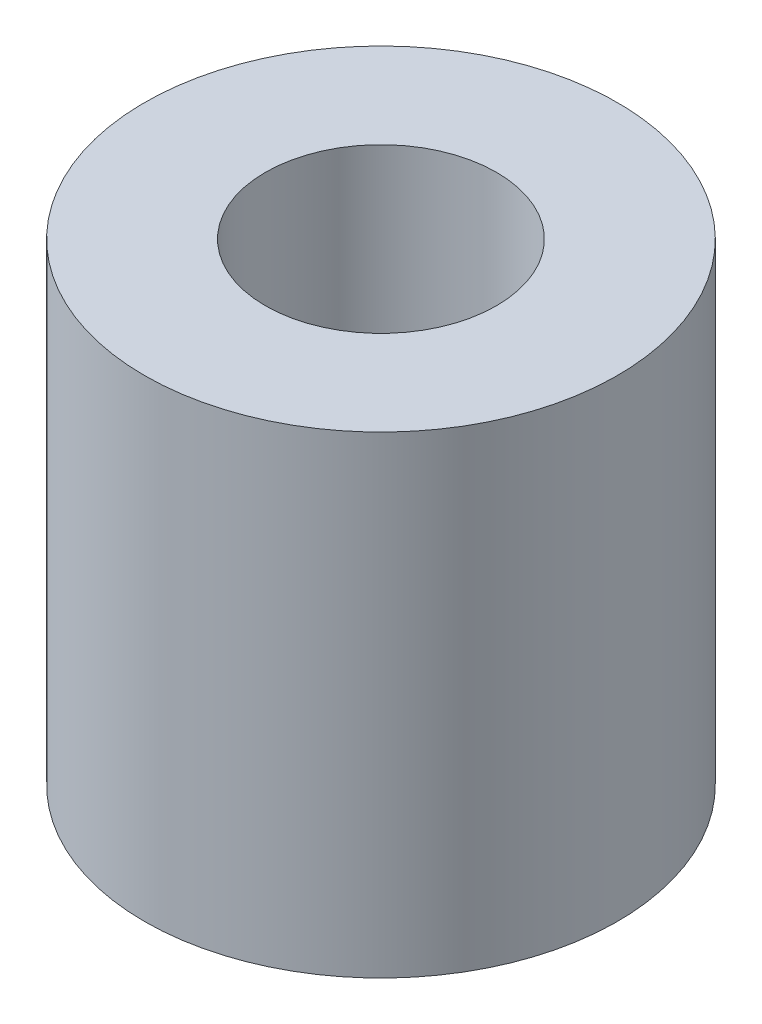
ISO-10303-21;
HEADER;
FILE_DESCRIPTION(('STEP AP214'),'2;1');
FILE_NAME('part.step','',(''),(''),'','','');
FILE_SCHEMA(('AUTOMOTIVE_DESIGN { 1 0 10303 214 1 1 1 1 }'));
ENDSEC;
DATA;
#1=APPLICATION_CONTEXT('core data for automotive mechanical design processes');
#2=APPLICATION_PROTOCOL_DEFINITION('international standard','automotive_design',2000,#1);
#3=PRODUCT_CONTEXT('',#1,'mechanical');
#4=PRODUCT('Part','Part','',(#3));
#5=PRODUCT_RELATED_PRODUCT_CATEGORY('part','',(#4));
#6=PRODUCT_DEFINITION_FORMATION('','',#4);
#7=PRODUCT_DEFINITION_CONTEXT('part definition',#1,'design');
#8=PRODUCT_DEFINITION('design','',#6,#7);
#9=PRODUCT_DEFINITION_SHAPE('','',#8);
#10=(LENGTH_UNIT() NAMED_UNIT(*) SI_UNIT(.MILLI.,.METRE.));
#11=(NAMED_UNIT(*) PLANE_ANGLE_UNIT() SI_UNIT($,.RADIAN.));
#12=(NAMED_UNIT(*) SI_UNIT($,.STERADIAN.) SOLID_ANGLE_UNIT());
#13=UNCERTAINTY_MEASURE_WITH_UNIT(LENGTH_MEASURE(1.E-05),#10,'distance_accuracy_value','');
#14=(GEOMETRIC_REPRESENTATION_CONTEXT(3) GLOBAL_UNCERTAINTY_ASSIGNED_CONTEXT((#13)) GLOBAL_UNIT_ASSIGNED_CONTEXT((#10,
#11,#12)) REPRESENTATION_CONTEXT('',''));
#15=CARTESIAN_POINT('',(0.,0.,0.));
#16=DIRECTION('',(0.,0.,1.));
#17=DIRECTION('',(1.,0.,0.));
#18=AXIS2_PLACEMENT_3D('',#15,#16,#17);
#19=CARTESIAN_POINT('',(0.,4.5,0.));
#20=DIRECTION('',(0.,1.,0.));
#21=DIRECTION('',(0.,0.,1.));
#22=AXIS2_PLACEMENT_3D('',#19,#20,#21);
#23=PLANE('',#22);
#24=CARTESIAN_POINT('',(0.,4.5,0.));
#25=DIRECTION('',(0.,1.,0.));
#26=DIRECTION('',(0.,0.,1.));
#27=AXIS2_PLACEMENT_3D('',#24,#25,#26);
#28=CIRCLE('',#27,2.25);
#29=CARTESIAN_POINT('',(0.,4.5,2.25));
#30=VERTEX_POINT('',#29);
#31=EDGE_CURVE('E10',#30,#30,#28,.T.);
#32=ORIENTED_EDGE('',*,*,#31,.T.);
#33=EDGE_LOOP('',(#32));
#34=FACE_BOUND('',#33,.T.);
#35=CARTESIAN_POINT('',(0.,4.5,0.));
#36=DIRECTION('',(0.,1.,0.));
#37=DIRECTION('',(0.,0.,1.));
#38=AXIS2_PLACEMENT_3D('',#35,#36,#37);
#39=CIRCLE('',#38,1.1);
#40=CARTESIAN_POINT('',(0.,4.5,1.1));
#41=VERTEX_POINT('',#40);
#42=EDGE_CURVE('E50',#41,#41,#39,.T.);
#43=ORIENTED_EDGE('',*,*,#42,.F.);
#44=EDGE_LOOP('',(#43));
#45=FACE_BOUND('',#44,.T.);
#46=ADVANCED_FACE('F37',(#34,#45),#23,.T.);
#47=CARTESIAN_POINT('',(0.,0.,0.));
#48=DIRECTION('',(0.,1.,0.));
#49=DIRECTION('',(0.,0.,1.));
#50=AXIS2_PLACEMENT_3D('',#47,#48,#49);
#51=PLANE('',#50);
#52=CARTESIAN_POINT('',(0.,0.,0.));
#53=DIRECTION('',(0.,1.,0.));
#54=DIRECTION('',(0.,0.,1.));
#55=AXIS2_PLACEMENT_3D('',#52,#53,#54);
#56=CIRCLE('',#55,2.25);
#57=CARTESIAN_POINT('',(0.,0.,2.25));
#58=VERTEX_POINT('',#57);
#59=EDGE_CURVE('E41',#58,#58,#56,.T.);
#60=ORIENTED_EDGE('',*,*,#59,.F.);
#61=EDGE_LOOP('',(#60));
#62=FACE_BOUND('',#61,.T.);
#63=CARTESIAN_POINT('',(0.,0.,0.));
#64=DIRECTION('',(0.,1.,0.));
#65=DIRECTION('',(0.,0.,1.));
#66=AXIS2_PLACEMENT_3D('',#63,#64,#65);
#67=CIRCLE('',#66,1.1);
#68=CARTESIAN_POINT('',(0.,0.,1.1));
#69=VERTEX_POINT('',#68);
#70=EDGE_CURVE('E52',#69,#69,#67,.T.);
#71=ORIENTED_EDGE('',*,*,#70,.T.);
#72=EDGE_LOOP('',(#71));
#73=FACE_BOUND('',#72,.T.);
#74=ADVANCED_FACE('F64',(#62,#73),#51,.F.);
#75=CARTESIAN_POINT('',(0.,4.5,0.));
#76=DIRECTION('',(0.,-1.,0.));
#77=DIRECTION('',(0.,0.,-1.));
#78=AXIS2_PLACEMENT_3D('',#75,#76,#77);
#79=CYLINDRICAL_SURFACE('',#78,2.25);
#80=ORIENTED_EDGE('',*,*,#31,.F.);
#81=EDGE_LOOP('',(#80));
#82=FACE_BOUND('',#81,.T.);
#83=ORIENTED_EDGE('',*,*,#59,.T.);
#84=EDGE_LOOP('',(#83));
#85=FACE_BOUND('',#84,.T.);
#86=ADVANCED_FACE('F39',(#82,#85),#79,.T.);
#87=CARTESIAN_POINT('',(0.,4.5,0.));
#88=DIRECTION('',(0.,-1.,0.));
#89=DIRECTION('',(0.,0.,-1.));
#90=AXIS2_PLACEMENT_3D('',#87,#88,#89);
#91=CYLINDRICAL_SURFACE('',#90,1.1);
#92=ORIENTED_EDGE('',*,*,#42,.T.);
#93=EDGE_LOOP('',(#92));
#94=FACE_BOUND('',#93,.T.);
#95=ORIENTED_EDGE('',*,*,#70,.F.);
#96=EDGE_LOOP('',(#95));
#97=FACE_BOUND('',#96,.T.);
#98=ADVANCED_FACE('F60',(#94,#97),#91,.F.);
#99=CLOSED_SHELL('',(#46,#74,#86,#98));
#100=MANIFOLD_SOLID_BREP('B2',#99);
#101=ADVANCED_BREP_SHAPE_REPRESENTATION('',(#18,#100),#14);
#102=SHAPE_DEFINITION_REPRESENTATION(#9,#101);
ENDSEC;
END-ISO-10303-21;
